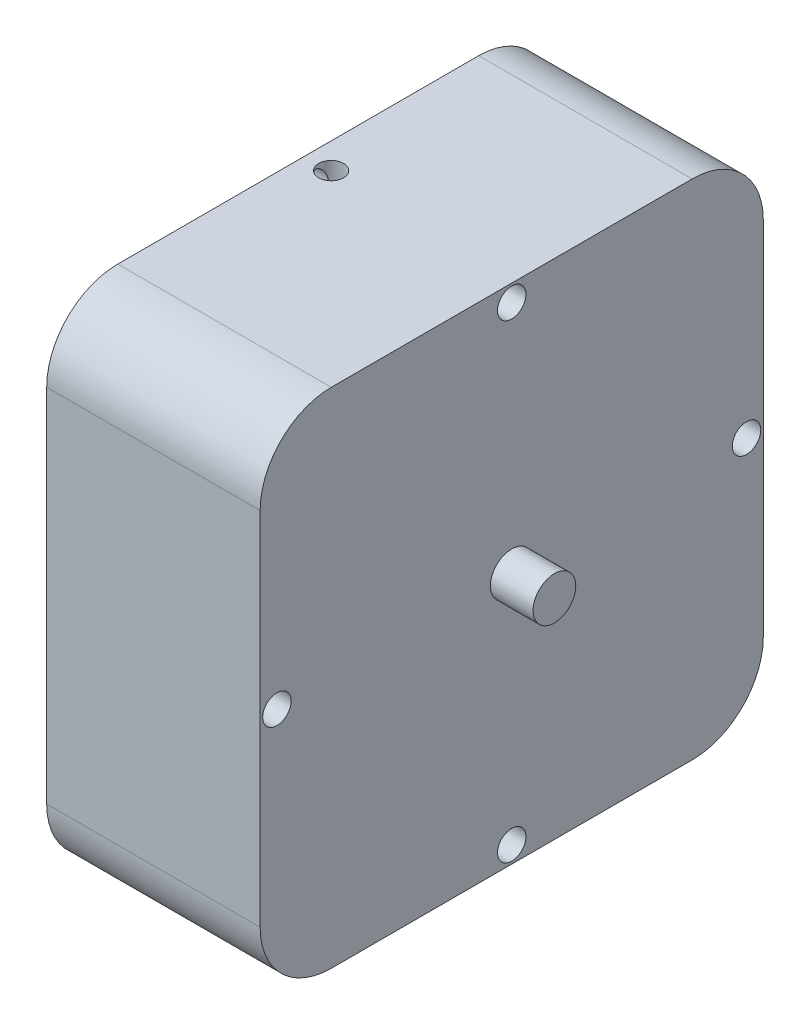
ISO-10303-21;
HEADER;
FILE_DESCRIPTION(('STEP AP214'),'2;1');
FILE_NAME('part.step','',(''),(''),'','','');
FILE_SCHEMA(('AUTOMOTIVE_DESIGN { 1 0 10303 214 1 1 1 1 }'));
ENDSEC;
DATA;
#1=APPLICATION_CONTEXT('core data for automotive mechanical design processes');
#2=APPLICATION_PROTOCOL_DEFINITION('international standard','automotive_design',2000,#1);
#3=PRODUCT_CONTEXT('',#1,'mechanical');
#4=PRODUCT('Part','Part','',(#3));
#5=PRODUCT_RELATED_PRODUCT_CATEGORY('part','',(#4));
#6=PRODUCT_DEFINITION_FORMATION('','',#4);
#7=PRODUCT_DEFINITION_CONTEXT('part definition',#1,'design');
#8=PRODUCT_DEFINITION('design','',#6,#7);
#9=PRODUCT_DEFINITION_SHAPE('','',#8);
#10=(LENGTH_UNIT() NAMED_UNIT(*) SI_UNIT(.MILLI.,.METRE.));
#11=(NAMED_UNIT(*) PLANE_ANGLE_UNIT() SI_UNIT($,.RADIAN.));
#12=(NAMED_UNIT(*) SI_UNIT($,.STERADIAN.) SOLID_ANGLE_UNIT());
#13=UNCERTAINTY_MEASURE_WITH_UNIT(LENGTH_MEASURE(1.E-05),#10,'distance_accuracy_value','');
#14=(GEOMETRIC_REPRESENTATION_CONTEXT(3) GLOBAL_UNCERTAINTY_ASSIGNED_CONTEXT((#13)) GLOBAL_UNIT_ASSIGNED_CONTEXT((#10,
#11,#12)) REPRESENTATION_CONTEXT('',''));
#15=CARTESIAN_POINT('',(0.,0.,0.));
#16=DIRECTION('',(0.,0.,1.));
#17=DIRECTION('',(1.,0.,0.));
#18=AXIS2_PLACEMENT_3D('',#15,#16,#17);
#19=CARTESIAN_POINT('',(30.,25.36,25.36));
#20=DIRECTION('',(1.,0.,0.));
#21=DIRECTION('',(0.,0.,-1.));
#22=AXIS2_PLACEMENT_3D('',#19,#20,#21);
#23=CYLINDRICAL_SURFACE('',#22,10.);
#24=DIRECTION('',(1.,0.,0.));
#25=VECTOR('',#24,1.);
#26=CARTESIAN_POINT('',(30.,35.36,25.36));
#27=LINE('',#26,#25);
#28=CARTESIAN_POINT('',(0.,35.36,25.36));
#29=VERTEX_POINT('',#28);
#30=CARTESIAN_POINT('',(30.,35.36,25.36));
#31=VERTEX_POINT('',#30);
#32=EDGE_CURVE('E161',#29,#31,#27,.T.);
#33=ORIENTED_EDGE('',*,*,#32,.F.);
#34=CARTESIAN_POINT('',(0.,25.36,25.36));
#35=DIRECTION('',(1.,0.,0.));
#36=DIRECTION('',(0.,0.,-1.));
#37=AXIS2_PLACEMENT_3D('',#34,#35,#36);
#38=CIRCLE('',#37,10.);
#39=CARTESIAN_POINT('',(0.,25.36,35.36));
#40=VERTEX_POINT('',#39);
#41=EDGE_CURVE('E46',#40,#29,#38,.F.);
#42=ORIENTED_EDGE('',*,*,#41,.F.);
#43=DIRECTION('',(1.,0.,0.));
#44=VECTOR('',#43,1.);
#45=CARTESIAN_POINT('',(30.,25.36,35.36));
#46=LINE('',#45,#44);
#47=CARTESIAN_POINT('',(30.,25.36,35.36));
#48=VERTEX_POINT('',#47);
#49=EDGE_CURVE('E164',#48,#40,#46,.F.);
#50=ORIENTED_EDGE('',*,*,#49,.F.);
#51=CARTESIAN_POINT('',(30.,25.36,25.36));
#52=DIRECTION('',(1.,0.,0.));
#53=DIRECTION('',(0.,0.,-1.));
#54=AXIS2_PLACEMENT_3D('',#51,#52,#53);
#55=CIRCLE('',#54,10.);
#56=EDGE_CURVE('E11',#31,#48,#55,.T.);
#57=ORIENTED_EDGE('',*,*,#56,.F.);
#58=EDGE_LOOP('',(#33,#42,#50,#57));
#59=FACE_BOUND('',#58,.T.);
#60=ADVANCED_FACE('F39',(#59),#23,.T.);
#61=CARTESIAN_POINT('',(30.,-25.36,25.36));
#62=DIRECTION('',(1.,0.,0.));
#63=DIRECTION('',(0.,0.,-1.));
#64=AXIS2_PLACEMENT_3D('',#61,#62,#63);
#65=CYLINDRICAL_SURFACE('',#64,10.);
#66=DIRECTION('',(1.,0.,0.));
#67=VECTOR('',#66,1.);
#68=CARTESIAN_POINT('',(30.,-25.36,35.36));
#69=LINE('',#68,#67);
#70=CARTESIAN_POINT('',(0.,-25.36,35.36));
#71=VERTEX_POINT('',#70);
#72=CARTESIAN_POINT('',(30.,-25.36,35.36));
#73=VERTEX_POINT('',#72);
#74=EDGE_CURVE('E150',#71,#73,#69,.T.);
#75=ORIENTED_EDGE('',*,*,#74,.F.);
#76=CARTESIAN_POINT('',(0.,-25.36,25.36));
#77=DIRECTION('',(1.,0.,0.));
#78=DIRECTION('',(0.,0.,-1.));
#79=AXIS2_PLACEMENT_3D('',#76,#77,#78);
#80=CIRCLE('',#79,10.);
#81=CARTESIAN_POINT('',(0.,-35.36,25.36));
#82=VERTEX_POINT('',#81);
#83=EDGE_CURVE('E156',#82,#71,#80,.F.);
#84=ORIENTED_EDGE('',*,*,#83,.F.);
#85=DIRECTION('',(1.,0.,0.));
#86=VECTOR('',#85,1.);
#87=CARTESIAN_POINT('',(30.,-35.36,25.36));
#88=LINE('',#87,#86);
#89=CARTESIAN_POINT('',(30.,-35.36,25.36));
#90=VERTEX_POINT('',#89);
#91=EDGE_CURVE('E153',#90,#82,#88,.F.);
#92=ORIENTED_EDGE('',*,*,#91,.F.);
#93=CARTESIAN_POINT('',(30.,-25.36,25.36));
#94=DIRECTION('',(1.,0.,0.));
#95=DIRECTION('',(0.,0.,-1.));
#96=AXIS2_PLACEMENT_3D('',#93,#94,#95);
#97=CIRCLE('',#96,10.);
#98=EDGE_CURVE('E159',#73,#90,#97,.T.);
#99=ORIENTED_EDGE('',*,*,#98,.F.);
#100=EDGE_LOOP('',(#75,#84,#92,#99));
#101=FACE_BOUND('',#100,.T.);
#102=ADVANCED_FACE('F189',(#101),#65,.T.);
#103=CARTESIAN_POINT('',(30.,-25.36,-25.36));
#104=DIRECTION('',(1.,0.,0.));
#105=DIRECTION('',(0.,0.,-1.));
#106=AXIS2_PLACEMENT_3D('',#103,#104,#105);
#107=CYLINDRICAL_SURFACE('',#106,10.);
#108=DIRECTION('',(1.,0.,0.));
#109=VECTOR('',#108,1.);
#110=CARTESIAN_POINT('',(30.,-35.36,-25.36));
#111=LINE('',#110,#109);
#112=CARTESIAN_POINT('',(0.,-35.36,-25.36));
#113=VERTEX_POINT('',#112);
#114=CARTESIAN_POINT('',(30.,-35.36,-25.36));
#115=VERTEX_POINT('',#114);
#116=EDGE_CURVE('E142',#113,#115,#111,.T.);
#117=ORIENTED_EDGE('',*,*,#116,.F.);
#118=CARTESIAN_POINT('',(0.,-25.36,-25.36));
#119=DIRECTION('',(1.,0.,0.));
#120=DIRECTION('',(0.,0.,-1.));
#121=AXIS2_PLACEMENT_3D('',#118,#119,#120);
#122=CIRCLE('',#121,10.);
#123=CARTESIAN_POINT('',(0.,-25.36,-35.36));
#124=VERTEX_POINT('',#123);
#125=EDGE_CURVE('E146',#124,#113,#122,.F.);
#126=ORIENTED_EDGE('',*,*,#125,.F.);
#127=DIRECTION('',(1.,0.,0.));
#128=VECTOR('',#127,1.);
#129=CARTESIAN_POINT('',(30.,-25.36,-35.36));
#130=LINE('',#129,#128);
#131=CARTESIAN_POINT('',(30.,-25.36,-35.36));
#132=VERTEX_POINT('',#131);
#133=EDGE_CURVE('E108',#132,#124,#130,.F.);
#134=ORIENTED_EDGE('',*,*,#133,.F.);
#135=CARTESIAN_POINT('',(30.,-25.36,-25.36));
#136=DIRECTION('',(1.,0.,0.));
#137=DIRECTION('',(0.,0.,-1.));
#138=AXIS2_PLACEMENT_3D('',#135,#136,#137);
#139=CIRCLE('',#138,10.);
#140=EDGE_CURVE('E148',#115,#132,#139,.T.);
#141=ORIENTED_EDGE('',*,*,#140,.F.);
#142=EDGE_LOOP('',(#117,#126,#134,#141));
#143=FACE_BOUND('',#142,.T.);
#144=ADVANCED_FACE('F196',(#143),#107,.T.);
#145=CARTESIAN_POINT('',(30.,25.36,-25.36));
#146=DIRECTION('',(1.,0.,0.));
#147=DIRECTION('',(0.,0.,-1.));
#148=AXIS2_PLACEMENT_3D('',#145,#146,#147);
#149=CYLINDRICAL_SURFACE('',#148,10.);
#150=DIRECTION('',(1.,0.,0.));
#151=VECTOR('',#150,1.);
#152=CARTESIAN_POINT('',(30.,25.36,-35.36));
#153=LINE('',#152,#151);
#154=CARTESIAN_POINT('',(0.,25.36,-35.36));
#155=VERTEX_POINT('',#154);
#156=CARTESIAN_POINT('',(30.,25.36,-35.36));
#157=VERTEX_POINT('',#156);
#158=EDGE_CURVE('E106',#155,#157,#153,.T.);
#159=ORIENTED_EDGE('',*,*,#158,.F.);
#160=CARTESIAN_POINT('',(0.,25.36,-25.36));
#161=DIRECTION('',(1.,0.,0.));
#162=DIRECTION('',(0.,0.,-1.));
#163=AXIS2_PLACEMENT_3D('',#160,#161,#162);
#164=CIRCLE('',#163,10.);
#165=CARTESIAN_POINT('',(0.,35.36,-25.36));
#166=VERTEX_POINT('',#165);
#167=EDGE_CURVE('E115',#166,#155,#164,.F.);
#168=ORIENTED_EDGE('',*,*,#167,.F.);
#169=DIRECTION('',(1.,0.,0.));
#170=VECTOR('',#169,1.);
#171=CARTESIAN_POINT('',(30.,35.36,-25.36));
#172=LINE('',#171,#170);
#173=CARTESIAN_POINT('',(30.,35.36,-25.36));
#174=VERTEX_POINT('',#173);
#175=EDGE_CURVE('E123',#174,#166,#172,.F.);
#176=ORIENTED_EDGE('',*,*,#175,.F.);
#177=CARTESIAN_POINT('',(30.,25.36,-25.36));
#178=DIRECTION('',(1.,0.,0.));
#179=DIRECTION('',(0.,0.,-1.));
#180=AXIS2_PLACEMENT_3D('',#177,#178,#179);
#181=CIRCLE('',#180,10.);
#182=EDGE_CURVE('E122',#157,#174,#181,.T.);
#183=ORIENTED_EDGE('',*,*,#182,.F.);
#184=EDGE_LOOP('',(#159,#168,#176,#183));
#185=FACE_BOUND('',#184,.T.);
#186=ADVANCED_FACE('F126',(#185),#149,.T.);
#187=CARTESIAN_POINT('',(30.,35.36,-35.36));
#188=DIRECTION('',(0.,0.,1.));
#189=DIRECTION('',(1.,0.,0.));
#190=AXIS2_PLACEMENT_3D('',#187,#188,#189);
#191=PLANE('',#190);
#192=DIRECTION('',(0.,1.,0.));
#193=VECTOR('',#192,1.);
#194=CARTESIAN_POINT('',(30.,35.36,-35.36));
#195=LINE('',#194,#193);
#196=EDGE_CURVE('E172',#132,#157,#195,.T.);
#197=ORIENTED_EDGE('',*,*,#196,.F.);
#198=ORIENTED_EDGE('',*,*,#133,.T.);
#199=DIRECTION('',(0.,1.,0.));
#200=VECTOR('',#199,1.);
#201=CARTESIAN_POINT('',(0.,35.36,-35.36));
#202=LINE('',#201,#200);
#203=EDGE_CURVE('E101',#124,#155,#202,.T.);
#204=ORIENTED_EDGE('',*,*,#203,.T.);
#205=ORIENTED_EDGE('',*,*,#158,.T.);
#206=EDGE_LOOP('',(#197,#198,#204,#205));
#207=FACE_BOUND('',#206,.T.);
#208=ADVANCED_FACE('F104',(#207),#191,.F.);
#209=CARTESIAN_POINT('',(30.,35.36,35.36));
#210=DIRECTION('',(0.,-1.,0.));
#211=DIRECTION('',(0.,0.,-1.));
#212=AXIS2_PLACEMENT_3D('',#209,#210,#211);
#213=PLANE('',#212);
#214=CARTESIAN_POINT('',(3.62,35.36,-0.999999999999997));
#215=DIRECTION('',(0.,1.,0.));
#216=DIRECTION('',(0.,0.,1.));
#217=AXIS2_PLACEMENT_3D('',#214,#215,#216);
#218=CIRCLE('',#217,1.75);
#219=CARTESIAN_POINT('',(3.62,35.36,0.750000000000003));
#220=VERTEX_POINT('',#219);
#221=EDGE_CURVE('E421',#220,#220,#218,.T.);
#222=ORIENTED_EDGE('',*,*,#221,.F.);
#223=EDGE_LOOP('',(#222));
#224=FACE_BOUND('',#223,.T.);
#225=DIRECTION('',(0.,0.,1.));
#226=VECTOR('',#225,1.);
#227=CARTESIAN_POINT('',(0.,35.36,35.36));
#228=LINE('',#227,#226);
#229=EDGE_CURVE('E111',#166,#29,#228,.T.);
#230=ORIENTED_EDGE('',*,*,#229,.T.);
#231=ORIENTED_EDGE('',*,*,#32,.T.);
#232=DIRECTION('',(0.,0.,1.));
#233=VECTOR('',#232,1.);
#234=CARTESIAN_POINT('',(30.,35.36,35.36));
#235=LINE('',#234,#233);
#236=EDGE_CURVE('E175',#174,#31,#235,.T.);
#237=ORIENTED_EDGE('',*,*,#236,.F.);
#238=ORIENTED_EDGE('',*,*,#175,.T.);
#239=EDGE_LOOP('',(#230,#231,#237,#238));
#240=FACE_BOUND('',#239,.T.);
#241=ADVANCED_FACE('F168',(#224,#240),#213,.F.);
#242=CARTESIAN_POINT('',(30.,35.36,35.36));
#243=DIRECTION('',(0.,0.,-1.));
#244=DIRECTION('',(0.,1.,0.));
#245=AXIS2_PLACEMENT_3D('',#242,#243,#244);
#246=PLANE('',#245);
#247=DIRECTION('',(0.,-1.,0.));
#248=VECTOR('',#247,1.);
#249=CARTESIAN_POINT('',(30.,35.36,35.36));
#250=LINE('',#249,#248);
#251=EDGE_CURVE('E130',#48,#73,#250,.T.);
#252=ORIENTED_EDGE('',*,*,#251,.F.);
#253=ORIENTED_EDGE('',*,*,#49,.T.);
#254=DIRECTION('',(0.,-1.,0.));
#255=VECTOR('',#254,1.);
#256=CARTESIAN_POINT('',(0.,35.36,35.36));
#257=LINE('',#256,#255);
#258=EDGE_CURVE('E165',#40,#71,#257,.T.);
#259=ORIENTED_EDGE('',*,*,#258,.T.);
#260=ORIENTED_EDGE('',*,*,#74,.T.);
#261=EDGE_LOOP('',(#252,#253,#259,#260));
#262=FACE_BOUND('',#261,.T.);
#263=ADVANCED_FACE('F191',(#262),#246,.F.);
#264=CARTESIAN_POINT('',(30.,-35.36,35.36));
#265=DIRECTION('',(0.,1.,0.));
#266=DIRECTION('',(0.,0.,1.));
#267=AXIS2_PLACEMENT_3D('',#264,#265,#266);
#268=PLANE('',#267);
#269=DIRECTION('',(0.,0.,-1.));
#270=VECTOR('',#269,1.);
#271=CARTESIAN_POINT('',(30.,-35.36,35.36));
#272=LINE('',#271,#270);
#273=EDGE_CURVE('E127',#90,#115,#272,.T.);
#274=ORIENTED_EDGE('',*,*,#273,.F.);
#275=ORIENTED_EDGE('',*,*,#91,.T.);
#276=DIRECTION('',(0.,0.,-1.));
#277=VECTOR('',#276,1.);
#278=CARTESIAN_POINT('',(0.,-35.36,35.36));
#279=LINE('',#278,#277);
#280=EDGE_CURVE('E170',#82,#113,#279,.T.);
#281=ORIENTED_EDGE('',*,*,#280,.T.);
#282=ORIENTED_EDGE('',*,*,#116,.T.);
#283=EDGE_LOOP('',(#274,#275,#281,#282));
#284=FACE_BOUND('',#283,.T.);
#285=ADVANCED_FACE('F192',(#284),#268,.F.);
#286=CARTESIAN_POINT('',(30.,0.,0.));
#287=DIRECTION('',(1.,0.,0.));
#288=DIRECTION('',(0.,0.,-1.));
#289=AXIS2_PLACEMENT_3D('',#286,#287,#288);
#290=PLANE('',#289);
#291=CARTESIAN_POINT('',(30.,33.,0.));
#292=DIRECTION('',(1.,0.,0.));
#293=DIRECTION('',(0.,0.,-1.));
#294=AXIS2_PLACEMENT_3D('',#291,#292,#293);
#295=CIRCLE('',#294,2.);
#296=CARTESIAN_POINT('',(30.,33.,-2.));
#297=VERTEX_POINT('',#296);
#298=EDGE_CURVE('E453',#297,#297,#295,.T.);
#299=ORIENTED_EDGE('',*,*,#298,.F.);
#300=EDGE_LOOP('',(#299));
#301=FACE_BOUND('',#300,.T.);
#302=CARTESIAN_POINT('',(30.,-1.15218884181823E-13,33.));
#303=DIRECTION('',(1.,0.,0.));
#304=DIRECTION('',(0.,0.,-1.));
#305=AXIS2_PLACEMENT_3D('',#302,#303,#304);
#306=CIRCLE('',#305,2.);
#307=CARTESIAN_POINT('',(30.,-1.15218884181823E-13,31.));
#308=VERTEX_POINT('',#307);
#309=EDGE_CURVE('E424',#308,#308,#306,.T.);
#310=ORIENTED_EDGE('',*,*,#309,.F.);
#311=EDGE_LOOP('',(#310));
#312=FACE_BOUND('',#311,.T.);
#313=CARTESIAN_POINT('',(30.,-33.,-2.30437768363647E-13));
#314=DIRECTION('',(1.,0.,0.));
#315=DIRECTION('',(0.,0.,-1.));
#316=AXIS2_PLACEMENT_3D('',#313,#314,#315);
#317=CIRCLE('',#316,2.);
#318=CARTESIAN_POINT('',(30.,-33.,-2.00000000000023));
#319=VERTEX_POINT('',#318);
#320=EDGE_CURVE('E430',#319,#319,#317,.T.);
#321=ORIENTED_EDGE('',*,*,#320,.F.);
#322=EDGE_LOOP('',(#321));
#323=FACE_BOUND('',#322,.T.);
#324=CARTESIAN_POINT('',(30.,3.4565665254547E-13,-33.));
#325=DIRECTION('',(1.,0.,0.));
#326=DIRECTION('',(0.,0.,-1.));
#327=AXIS2_PLACEMENT_3D('',#324,#325,#326);
#328=CIRCLE('',#327,2.);
#329=CARTESIAN_POINT('',(30.,3.4565665254547E-13,-35.));
#330=VERTEX_POINT('',#329);
#331=EDGE_CURVE('E450',#330,#330,#328,.T.);
#332=ORIENTED_EDGE('',*,*,#331,.F.);
#333=EDGE_LOOP('',(#332));
#334=FACE_BOUND('',#333,.T.);
#335=CARTESIAN_POINT('',(30.,0.,0.));
#336=DIRECTION('',(1.,0.,0.));
#337=DIRECTION('',(0.,0.,-1.));
#338=AXIS2_PLACEMENT_3D('',#335,#336,#337);
#339=CIRCLE('',#338,3.);
#340=CARTESIAN_POINT('',(30.,0.,-3.));
#341=VERTEX_POINT('',#340);
#342=EDGE_CURVE('E427',#341,#341,#339,.T.);
#343=ORIENTED_EDGE('',*,*,#342,.F.);
#344=EDGE_LOOP('',(#343));
#345=FACE_BOUND('',#344,.T.);
#346=ORIENTED_EDGE('',*,*,#236,.T.);
#347=ORIENTED_EDGE('',*,*,#56,.T.);
#348=ORIENTED_EDGE('',*,*,#251,.T.);
#349=ORIENTED_EDGE('',*,*,#98,.T.);
#350=ORIENTED_EDGE('',*,*,#273,.T.);
#351=ORIENTED_EDGE('',*,*,#140,.T.);
#352=ORIENTED_EDGE('',*,*,#196,.T.);
#353=ORIENTED_EDGE('',*,*,#182,.T.);
#354=EDGE_LOOP('',(#346,#347,#348,#349,#350,#351,#352,#353));
#355=FACE_BOUND('',#354,.T.);
#356=ADVANCED_FACE('F184',(#301,#312,#323,#334,#345,#355),#290,.T.);
#357=CARTESIAN_POINT('',(0.,0.,0.));
#358=DIRECTION('',(1.,0.,0.));
#359=DIRECTION('',(0.,0.,-1.));
#360=AXIS2_PLACEMENT_3D('',#357,#358,#359);
#361=PLANE('',#360);
#362=CARTESIAN_POINT('',(0.,33.,0.));
#363=DIRECTION('',(-1.,0.,0.));
#364=DIRECTION('',(0.,0.,1.));
#365=AXIS2_PLACEMENT_3D('',#362,#363,#364);
#366=CIRCLE('',#365,2.);
#367=CARTESIAN_POINT('',(0.,33.,2.));
#368=VERTEX_POINT('',#367);
#369=EDGE_CURVE('E465',#368,#368,#366,.T.);
#370=ORIENTED_EDGE('',*,*,#369,.F.);
#371=EDGE_LOOP('',(#370));
#372=FACE_BOUND('',#371,.T.);
#373=CARTESIAN_POINT('',(0.,-1.15218884181823E-13,33.));
#374=DIRECTION('',(-1.,0.,0.));
#375=DIRECTION('',(0.,0.,1.));
#376=AXIS2_PLACEMENT_3D('',#373,#374,#375);
#377=CIRCLE('',#376,2.);
#378=CARTESIAN_POINT('',(0.,-1.15218884181823E-13,35.));
#379=VERTEX_POINT('',#378);
#380=EDGE_CURVE('E462',#379,#379,#377,.T.);
#381=ORIENTED_EDGE('',*,*,#380,.F.);
#382=EDGE_LOOP('',(#381));
#383=FACE_BOUND('',#382,.T.);
#384=CARTESIAN_POINT('',(0.,-33.,-2.30437768363647E-13));
#385=DIRECTION('',(-1.,0.,0.));
#386=DIRECTION('',(0.,0.,1.));
#387=AXIS2_PLACEMENT_3D('',#384,#385,#386);
#388=CIRCLE('',#387,2.);
#389=CARTESIAN_POINT('',(0.,-33.,1.99999999999977));
#390=VERTEX_POINT('',#389);
#391=EDGE_CURVE('E459',#390,#390,#388,.T.);
#392=ORIENTED_EDGE('',*,*,#391,.F.);
#393=EDGE_LOOP('',(#392));
#394=FACE_BOUND('',#393,.T.);
#395=CARTESIAN_POINT('',(0.,3.4565665254547E-13,-33.));
#396=DIRECTION('',(-1.,0.,0.));
#397=DIRECTION('',(0.,0.,1.));
#398=AXIS2_PLACEMENT_3D('',#395,#396,#397);
#399=CIRCLE('',#398,2.);
#400=CARTESIAN_POINT('',(0.,3.4565665254547E-13,-31.));
#401=VERTEX_POINT('',#400);
#402=EDGE_CURVE('E456',#401,#401,#399,.T.);
#403=ORIENTED_EDGE('',*,*,#402,.F.);
#404=EDGE_LOOP('',(#403));
#405=FACE_BOUND('',#404,.T.);
#406=CARTESIAN_POINT('',(0.,0.,0.));
#407=DIRECTION('',(-1.,0.,0.));
#408=DIRECTION('',(0.,0.,1.));
#409=AXIS2_PLACEMENT_3D('',#406,#407,#408);
#410=CIRCLE('',#409,3.);
#411=CARTESIAN_POINT('',(0.,0.,3.));
#412=VERTEX_POINT('',#411);
#413=EDGE_CURVE('E179',#412,#412,#410,.T.);
#414=ORIENTED_EDGE('',*,*,#413,.F.);
#415=EDGE_LOOP('',(#414));
#416=FACE_BOUND('',#415,.T.);
#417=ORIENTED_EDGE('',*,*,#258,.F.);
#418=ORIENTED_EDGE('',*,*,#41,.T.);
#419=ORIENTED_EDGE('',*,*,#229,.F.);
#420=ORIENTED_EDGE('',*,*,#167,.T.);
#421=ORIENTED_EDGE('',*,*,#203,.F.);
#422=ORIENTED_EDGE('',*,*,#125,.T.);
#423=ORIENTED_EDGE('',*,*,#280,.F.);
#424=ORIENTED_EDGE('',*,*,#83,.T.);
#425=EDGE_LOOP('',(#417,#418,#419,#420,#421,#422,#423,#424));
#426=FACE_BOUND('',#425,.T.);
#427=ADVANCED_FACE('F117',(#372,#383,#394,#405,#416,#426),#361,.F.);
#428=CARTESIAN_POINT('',(6.,0.,0.));
#429=DIRECTION('',(-1.,0.,0.));
#430=DIRECTION('',(0.,0.,1.));
#431=AXIS2_PLACEMENT_3D('',#428,#429,#430);
#432=CYLINDRICAL_SURFACE('',#431,3.);
#433=CARTESIAN_POINT('',(6.,0.,0.));
#434=DIRECTION('',(-1.,0.,0.));
#435=DIRECTION('',(0.,0.,1.));
#436=AXIS2_PLACEMENT_3D('',#433,#434,#435);
#437=CIRCLE('',#436,3.);
#438=CARTESIAN_POINT('',(6.,0.,3.));
#439=VERTEX_POINT('',#438);
#440=EDGE_CURVE('E112',#439,#439,#437,.T.);
#441=ORIENTED_EDGE('',*,*,#440,.F.);
#442=EDGE_LOOP('',(#441));
#443=FACE_BOUND('',#442,.T.);
#444=ORIENTED_EDGE('',*,*,#413,.T.);
#445=EDGE_LOOP('',(#444));
#446=FACE_BOUND('',#445,.T.);
#447=ADVANCED_FACE('F247',(#443,#446),#432,.F.);
#448=CARTESIAN_POINT('',(6.,0.,0.));
#449=DIRECTION('',(-1.,0.,0.));
#450=DIRECTION('',(0.,0.,1.));
#451=AXIS2_PLACEMENT_3D('',#448,#449,#450);
#452=PLANE('',#451);
#453=ORIENTED_EDGE('',*,*,#440,.T.);
#454=EDGE_LOOP('',(#453));
#455=FACE_BOUND('',#454,.T.);
#456=ADVANCED_FACE('F255',(#455),#452,.T.);
#457=CARTESIAN_POINT('',(36.,0.,0.));
#458=DIRECTION('',(-1.,0.,0.));
#459=DIRECTION('',(0.,0.,1.));
#460=AXIS2_PLACEMENT_3D('',#457,#458,#459);
#461=CYLINDRICAL_SURFACE('',#460,3.);
#462=CARTESIAN_POINT('',(36.,0.,0.));
#463=DIRECTION('',(1.,0.,0.));
#464=DIRECTION('',(0.,0.,-1.));
#465=AXIS2_PLACEMENT_3D('',#462,#463,#464);
#466=CIRCLE('',#465,3.);
#467=CARTESIAN_POINT('',(36.,0.,-3.));
#468=VERTEX_POINT('',#467);
#469=EDGE_CURVE('E433',#468,#468,#466,.T.);
#470=ORIENTED_EDGE('',*,*,#469,.F.);
#471=EDGE_LOOP('',(#470));
#472=FACE_BOUND('',#471,.T.);
#473=ORIENTED_EDGE('',*,*,#342,.T.);
#474=EDGE_LOOP('',(#473));
#475=FACE_BOUND('',#474,.T.);
#476=ADVANCED_FACE('F263',(#472,#475),#461,.T.);
#477=CARTESIAN_POINT('',(36.,0.,0.));
#478=DIRECTION('',(1.,0.,0.));
#479=DIRECTION('',(0.,0.,-1.));
#480=AXIS2_PLACEMENT_3D('',#477,#478,#479);
#481=PLANE('',#480);
#482=ORIENTED_EDGE('',*,*,#469,.T.);
#483=EDGE_LOOP('',(#482));
#484=FACE_BOUND('',#483,.T.);
#485=ADVANCED_FACE('F272',(#484),#481,.T.);
#486=CARTESIAN_POINT('',(3.62,29.36,-0.999999999999997));
#487=DIRECTION('',(0.,1.,0.));
#488=DIRECTION('',(0.,0.,1.));
#489=AXIS2_PLACEMENT_3D('',#486,#487,#488);
#490=CYLINDRICAL_SURFACE('',#489,1.75);
#491=CARTESIAN_POINT('',(3.62,31.1459503782261,0.750000000000003));
#492=CARTESIAN_POINT('',(3.71567122252247,31.1459427294288,0.749995265416012));
#493=CARTESIAN_POINT('',(3.81149400773041,31.1426978377551,0.742108324100708));
#494=CARTESIAN_POINT('',(4.00034547105171,31.1305235333333,0.710861383675902));
#495=CARTESIAN_POINT('',(4.09336625940954,31.1215794018247,0.687461314282283));
#496=CARTESIAN_POINT('',(4.27362618915483,31.1002626292303,0.626130117337538));
#497=CARTESIAN_POINT('',(4.36088703990053,31.0879038947062,0.588257696224092));
#498=CARTESIAN_POINT('',(4.5280861394462,31.062684888981,0.498955845977584));
#499=CARTESIAN_POINT('',(4.60802355312473,31.0498245608188,0.447524873294089));
#500=CARTESIAN_POINT('',(4.76222214672776,31.0263785463246,0.329536723755242));
#501=CARTESIAN_POINT('',(4.83606380249904,31.015921852872,0.262401207933747));
#502=CARTESIAN_POINT('',(4.97154318498522,31.0020288298845,0.116126572924532));
#503=CARTESIAN_POINT('',(5.03319183999441,30.9985861878414,0.0369983159497344));
#504=CARTESIAN_POINT('',(5.13772296277647,31.0023531839096,-0.123937878524319));
#505=CARTESIAN_POINT('',(5.18169794349257,31.0087486535844,-0.205049078879844));
#506=CARTESIAN_POINT('',(5.25585616515758,31.033049426059,-0.371698384663576));
#507=CARTESIAN_POINT('',(5.28605634298406,31.0509405287607,-0.457230908906798));
#508=CARTESIAN_POINT('',(5.3290974288848,31.0957678645343,-0.616221403771476));
#509=CARTESIAN_POINT('',(5.34380450543892,31.1210425848853,-0.689655051472533));
#510=CARTESIAN_POINT('',(5.36364647601878,31.1805673899279,-0.834126829606587));
#511=CARTESIAN_POINT('',(5.36877950880369,31.2148192183374,-0.905164491613138));
#512=CARTESIAN_POINT('',(5.37083595501693,31.2916388504754,-1.04295380442132));
#513=CARTESIAN_POINT('',(5.36773264797927,31.3342333045966,-1.10969078399903));
#514=CARTESIAN_POINT('',(5.35503086533868,31.4266412193249,-1.23723617581522));
#515=CARTESIAN_POINT('',(5.34543070493518,31.4764565498564,-1.29804304554332));
#516=CARTESIAN_POINT('',(5.3196181145612,31.5911399683755,-1.42246774385959));
#517=CARTESIAN_POINT('',(5.30257148796752,31.6571336192018,-1.48487099566295));
#518=CARTESIAN_POINT('',(5.26509700600305,31.7964004914709,-1.59985128036666));
#519=CARTESIAN_POINT('',(5.24466441643199,31.869683847094,-1.65241433255971));
#520=CARTESIAN_POINT('',(5.19885341467715,32.0390255230096,-1.75740667097811));
#521=CARTESIAN_POINT('',(5.17335689119302,32.1365912436556,-1.80737306749631));
#522=CARTESIAN_POINT('',(5.12697816397803,32.3394987027212,-1.89096415359891));
#523=CARTESIAN_POINT('',(5.10609139385922,32.4448326067437,-1.92460505507327));
#524=CARTESIAN_POINT('',(5.07655358587552,32.6443353095237,-1.97035106133726));
#525=CARTESIAN_POINT('',(5.06650913788667,32.7377089804961,-1.98498344011316));
#526=CARTESIAN_POINT('',(5.05557745678009,32.9260667446993,-2.00086067101757));
#527=CARTESIAN_POINT('',(5.05467978686739,33.0210488785796,-2.00212078144195));
#528=CARTESIAN_POINT('',(5.06223071452228,33.2097593812072,-1.99121460892724));
#529=CARTESIAN_POINT('',(5.07067271271328,33.3034885879329,-1.97905780634633));
#530=CARTESIAN_POINT('',(5.09501405674426,33.4874112124937,-1.94197235852654));
#531=CARTESIAN_POINT('',(5.11092219252373,33.577600326567,-1.91702865597273));
#532=CARTESIAN_POINT('',(5.14814415163874,33.7573671520735,-1.85363256217801));
#533=CARTESIAN_POINT('',(5.169696332938,33.8466684585573,-1.8145443584692));
#534=CARTESIAN_POINT('',(5.21402296233502,34.0185152509202,-1.72397083188408));
#535=CARTESIAN_POINT('',(5.23679884698031,34.1010524960847,-1.67247067968607));
#536=CARTESIAN_POINT('',(5.28373131109178,34.272197316788,-1.5474646020449));
#537=CARTESIAN_POINT('',(5.30741756531207,34.3592895040399,-1.47167644822011));
#538=CARTESIAN_POINT('',(5.34532662682449,34.5199888050048,-1.30496843209341));
#539=CARTESIAN_POINT('',(5.35957134210494,34.5936268475918,-1.21408421617766));
#540=CARTESIAN_POINT('',(5.37060713372992,34.7044097318806,-1.04958579646888));
#541=CARTESIAN_POINT('',(5.37138758302347,34.7458432615005,-0.979120259981417));
#542=CARTESIAN_POINT('',(5.36362260058927,34.8196018839067,-0.834054015865772));
#543=CARTESIAN_POINT('',(5.35508597159807,34.8519355379411,-0.759457274542143));
#544=CARTESIAN_POINT('',(5.32734064645385,34.9069434547639,-0.608325172992275));
#545=CARTESIAN_POINT('',(5.3080896078941,34.9295787583757,-0.531783278349545));
#546=CARTESIAN_POINT('',(5.25845461555157,34.9651044534432,-0.38005150955174));
#547=CARTESIAN_POINT('',(5.22806913068696,34.9779935039584,-0.304861822829271));
#548=CARTESIAN_POINT('',(5.15877075266645,34.9945515445471,-0.163008830426277));
#549=CARTESIAN_POINT('',(5.12046270658593,34.9987170787215,-0.0961040963974897));
#550=CARTESIAN_POINT('',(5.03532876790393,35.0007711538258,0.0321206459063562));
#551=CARTESIAN_POINT('',(4.98850079505845,34.9986581598405,0.0934392847688713));
#552=CARTESIAN_POINT('',(4.88304277969146,34.989500199168,0.214161696716572));
#553=CARTESIAN_POINT('',(4.82374433289727,34.9820469956121,0.272948056048399));
#554=CARTESIAN_POINT('',(4.69766348584438,34.9640806746487,0.38132743470973));
#555=CARTESIAN_POINT('',(4.630875518504,34.953565271663,0.430913541690555));
#556=CARTESIAN_POINT('',(4.48079407577643,34.9301414156812,0.526618994220675));
#557=CARTESIAN_POINT('',(4.39651515908927,34.9171078840982,0.571170979222041));
#558=CARTESIAN_POINT('',(4.22158013218236,34.8931734036443,0.646103234795436));
#559=CARTESIAN_POINT('',(4.13092385761316,34.8822725097605,0.676483139987908));
#560=CARTESIAN_POINT('',(3.94233035403775,34.864962919212,0.722883938960019));
#561=CARTESIAN_POINT('',(3.84425159282752,34.8587142775012,0.738398085731686));
#562=CARTESIAN_POINT('',(3.64671591457171,34.8530167261339,0.75259250713544));
#563=CARTESIAN_POINT('',(3.54725976958409,34.8535641498586,0.751281859081254));
#564=CARTESIAN_POINT('',(3.35713517035316,34.8610159191363,0.732597395302313));
#565=CARTESIAN_POINT('',(3.26633541239328,34.8674770416605,0.716343201346525));
#566=CARTESIAN_POINT('',(3.08876148908296,34.88461644548,0.669944812498242));
#567=CARTESIAN_POINT('',(3.00198930878903,34.8952967821294,0.639793846717581));
#568=CARTESIAN_POINT('',(2.83160811325039,34.9188833454459,0.56520872423792));
#569=CARTESIAN_POINT('',(2.74820360268754,34.9318523479236,0.520328337342571));
#570=CARTESIAN_POINT('',(2.5895391628862,34.9566296419125,0.417599064170763));
#571=CARTESIAN_POINT('',(2.51428354072777,34.9684373193081,0.359743368952742));
#572=CARTESIAN_POINT('',(2.37047373048775,34.9879630265588,0.229243023769687));
#573=CARTESIAN_POINT('',(2.30239736370497,34.9954640387904,0.156033400957956));
#574=CARTESIAN_POINT('',(2.17960926038812,35.0015366875162,-0.00116156188895486));
#575=CARTESIAN_POINT('',(2.12487824509126,35.0001212850458,-0.0851310871762782));
#576=CARTESIAN_POINT('',(2.0363430005831,34.9858144538437,-0.250160924060528));
#577=CARTESIAN_POINT('',(2.00084704041221,34.9742742719866,-0.330427431113353));
#578=CARTESIAN_POINT('',(1.94277091156709,34.9400132729764,-0.493194477087015));
#579=CARTESIAN_POINT('',(1.92018123343804,34.9173007107478,-0.575693324136494));
#580=CARTESIAN_POINT('',(1.88952021408492,34.8638778189367,-0.729218097392116));
#581=CARTESIAN_POINT('',(1.88002175078171,34.8344694524343,-0.800423311400333));
#582=CARTESIAN_POINT('',(1.86965947047752,34.7673218524145,-0.939432831272657));
#583=CARTESIAN_POINT('',(1.8687978629394,34.7295804896905,-1.00723626248593));
#584=CARTESIAN_POINT('',(1.8743435677982,34.6445626587608,-1.14105928337489));
#585=CARTESIAN_POINT('',(1.88111982940598,34.5969011733489,-1.20681625877556));
#586=CARTESIAN_POINT('',(1.90053295507546,34.4944923821898,-1.33154657827843));
#587=CARTESIAN_POINT('',(1.91317182247187,34.439742658906,-1.3905175949193));
#588=CARTESIAN_POINT('',(1.94508137119412,34.3130106920299,-1.5116512796904));
#589=CARTESIAN_POINT('',(1.96515963062117,34.2397385022444,-1.57225076744762));
#590=CARTESIAN_POINT('',(2.0074189348576,34.085717344047,-1.68232373650952));
#591=CARTESIAN_POINT('',(2.02960347855687,34.0049559401708,-1.73177822770789));
#592=CARTESIAN_POINT('',(2.07689047851786,33.8204581535663,-1.82746238817236));
#593=CARTESIAN_POINT('',(2.10171856084011,33.7153123045901,-1.87118349689686));
#594=CARTESIAN_POINT('',(2.13311225237053,33.5522956213551,-1.92307713168238));
#595=CARTESIAN_POINT('',(2.14260062637388,33.4970865274922,-1.93809186491455));
#596=CARTESIAN_POINT('',(2.15896692588751,33.3852270718849,-1.96338512726579));
#597=CARTESIAN_POINT('',(2.16584663118157,33.3285777210246,-1.9736668865204));
#598=CARTESIAN_POINT('',(2.17611319885921,33.21795075775,-1.98882222608332));
#599=CARTESIAN_POINT('',(2.17969451987402,33.164032613203,-1.99399839962203));
#600=CARTESIAN_POINT('',(2.18382274356103,33.0558365102858,-1.99995422511256));
#601=CARTESIAN_POINT('',(2.18436980662196,33.0015585710858,-2.00073410944917));
#602=CARTESIAN_POINT('',(2.18238499978836,32.8931902820271,-1.99788092536753));
#603=CARTESIAN_POINT('',(2.17985399678483,32.8390998836522,-1.99424909944145));
#604=CARTESIAN_POINT('',(2.17191376580032,32.7315928374258,-1.98264607944293));
#605=CARTESIAN_POINT('',(2.16650331985623,32.6781764844811,-1.97467304907022));
#606=CARTESIAN_POINT('',(2.14833653297268,32.534057403269,-1.94718121063804));
#607=CARTESIAN_POINT('',(2.1330987346199,32.4444349878647,-1.92348255774055));
#608=CARTESIAN_POINT('',(2.09797234622715,32.2701384565334,-1.86435041392926));
#609=CARTESIAN_POINT('',(2.0780794299348,32.1854690357481,-1.82890599421128));
#610=CARTESIAN_POINT('',(2.03347682223897,32.009018595504,-1.74045478811288));
#611=CARTESIAN_POINT('',(2.0085044608426,31.9182510874437,-1.68555047432218));
#612=CARTESIAN_POINT('',(1.96126885217447,31.7460676686474,-1.56169345510934));
#613=CARTESIAN_POINT('',(1.93900441098861,31.6646476375304,-1.49274697696052));
#614=CARTESIAN_POINT('',(1.90475992438657,31.5245650957929,-1.35325798434364));
#615=CARTESIAN_POINT('',(1.89172860970239,31.4643259992933,-1.2845667546741));
#616=CARTESIAN_POINT('',(1.8739795406005,31.3533841391295,-1.13886702148481));
#617=CARTESIAN_POINT('',(1.86925511844665,31.3026737562344,-1.06186524138433));
#618=CARTESIAN_POINT('',(1.87094329059726,31.2119718175573,-0.900863717565469));
#619=CARTESIAN_POINT('',(1.8774571034442,31.1720814636053,-0.816806928141033));
#620=CARTESIAN_POINT('',(1.90403820387063,31.1049283542514,-0.645842771745452));
#621=CARTESIAN_POINT('',(1.92409232375992,31.077653374021,-0.558938252187169));
#622=CARTESIAN_POINT('',(1.97454222195533,31.0387787308234,-0.399215365816202));
#623=CARTESIAN_POINT('',(2.00300586372467,31.0254743535177,-0.326189247120555));
#624=CARTESIAN_POINT('',(2.06999149491843,31.0071716108308,-0.183812675985318));
#625=CARTESIAN_POINT('',(2.10851506709389,31.0021745533708,-0.114462804005022));
#626=CARTESIAN_POINT('',(2.19437610511551,30.9989891334782,0.0179837288101562));
#627=CARTESIAN_POINT('',(2.24165201052682,31.0007548151517,0.0811196163634015));
#628=CARTESIAN_POINT('',(2.3440539318405,31.0091547341307,0.200266598097837));
#629=CARTESIAN_POINT('',(2.39918218758629,31.0157903628142,0.25627565072477));
#630=CARTESIAN_POINT('',(2.52402386219868,31.0330908103406,0.367190668876703));
#631=CARTESIAN_POINT('',(2.5947018316837,31.044176123562,0.420945037537566));
#632=CARTESIAN_POINT('',(2.7433071391085,31.0673834602197,0.517154713470396));
#633=CARTESIAN_POINT('',(2.82124319845054,31.0795067294278,0.559596184353645));
#634=CARTESIAN_POINT('',(2.99212246518411,31.1034977678335,0.636466603305827));
#635=CARTESIAN_POINT('',(3.08576177309708,31.1151768575068,0.669418859341939));
#636=CARTESIAN_POINT('',(3.27757821486644,31.1335222899686,0.719012557392705));
#637=CARTESIAN_POINT('',(3.37574164113756,31.1402028380666,0.735700262700551));
#638=CARTESIAN_POINT('',(3.49874448400581,31.1443229309616,0.745963876071217));
#639=CARTESIAN_POINT('',(3.5229642203964,31.1449310853784,0.747476120194057));
#640=CARTESIAN_POINT('',(3.57145271698864,31.1457457837971,0.749494793594604));
#641=CARTESIAN_POINT('',(3.59572147822117,31.1459523192642,0.750001201497147));
#642=CARTESIAN_POINT('',(3.62,31.1459503782261,0.750000000000003));
#643=B_SPLINE_CURVE_WITH_KNOTS('',3,(#491,#492,#493,#494,#495,#496,#497,#498,#499,#500,#501,
#502,#503,#504,#505,#506,#507,#508,#509,#510,#511,#512,#513,#514,#515,#516,#517,#518,#519,#520,
#521,#522,#523,#524,#525,#526,#527,#528,#529,#530,#531,#532,#533,#534,#535,#536,#537,#538,#539,
#540,#541,#542,#543,#544,#545,#546,#547,#548,#549,#550,#551,#552,#553,#554,#555,#556,#557,#558,
#559,#560,#561,#562,#563,#564,#565,#566,#567,#568,#569,#570,#571,#572,#573,#574,#575,#576,#577,
#578,#579,#580,#581,#582,#583,#584,#585,#586,#587,#588,#589,#590,#591,#592,#593,#594,#595,#596,
#597,#598,#599,#600,#601,#602,#603,#604,#605,#606,#607,#608,#609,#610,#611,#612,#613,#614,#615,
#616,#617,#618,#619,#620,#621,#622,#623,#624,#625,#626,#627,#628,#629,#630,#631,#632,#633,#634,
#635,#636,#637,#638,#639,#640,#641,#642),.UNSPECIFIED.,.T.,.F.,(4,2,2,2,2,2,2,2,2,2,2,2,2,2,2,2,
2,2,2,2,2,2,2,2,2,2,2,2,2,2,2,2,2,2,2,2,2,2,2,2,2,2,2,2,2,2,2,2,2,2,2,2,2,2,2,2,2,2,2,2,2,2,2,2,
2,2,2,2,2,2,2,2,2,2,2,4),(0.,0.286913379813301,0.574570757148571,0.86107344369281,
1.14760876074762,1.44708754585595,1.74629668668,2.02204220676225,2.2974477625017,
2.53342747298273,2.76945305429146,3.00624528881881,3.24309895318356,3.51934659515813,
3.79598379256185,4.13215153586272,4.46798476412016,4.75184094551487,5.03537320071971,
5.31870524091394,5.60237169001738,5.90080980888468,6.19960627339991,6.55134166641105,
6.90225801434223,7.14649953114407,7.39051048918332,7.63549267533625,7.88050856128944,
8.11115033654892,8.34184850156751,8.59237231345362,8.84308359378633,9.13045785999068,
9.41783953476745,9.71470157188584,10.011403452725,10.2875411558437,10.5638135432778,
10.8493766674807,11.1350899963003,11.4341615336003,11.7327984364033,11.9967686109567,
12.2605440384517,12.4923694430626,12.7242541512631,12.9678386798124,13.2115065060031,
13.5019844737113,13.7929537100666,14.1406517777942,14.3144240248909,14.488077500334,
14.6506771965291,14.8132682977368,14.9758136182088,15.1384277477319,15.4190825473205,
15.6999992177567,16.0256344521485,16.351125590422,16.6269153091787,16.9024835571529,
17.180546719292,17.4583398590466,17.6956647477665,17.9330269978546,18.1687791343885,
18.4045986532047,18.6719899449166,18.9397067878899,19.238120070198,19.5356820393937,
19.6084906074211,19.6813007226968),.UNSPECIFIED.);
#644=CARTESIAN_POINT('',(3.62,31.1459503782261,0.750000000000003));
#645=VERTEX_POINT('',#644);
#646=EDGE_CURVE('E133',#645,#645,#643,.T.);
#647=ORIENTED_EDGE('',*,*,#646,.T.);
#648=EDGE_LOOP('',(#647));
#649=FACE_BOUND('',#648,.T.);
#650=CARTESIAN_POINT('',(3.62,29.36,-0.999999999999997));
#651=DIRECTION('',(0.,1.,0.));
#652=DIRECTION('',(0.,0.,1.));
#653=AXIS2_PLACEMENT_3D('',#650,#651,#652);
#654=CIRCLE('',#653,1.75);
#655=CARTESIAN_POINT('',(3.62,29.36,0.750000000000003));
#656=VERTEX_POINT('',#655);
#657=EDGE_CURVE('E423',#656,#656,#654,.T.);
#658=ORIENTED_EDGE('',*,*,#657,.F.);
#659=EDGE_LOOP('',(#658));
#660=FACE_BOUND('',#659,.T.);
#661=ORIENTED_EDGE('',*,*,#221,.T.);
#662=EDGE_LOOP('',(#661));
#663=FACE_BOUND('',#662,.T.);
#664=ADVANCED_FACE('F279',(#649,#660,#663),#490,.F.);
#665=CARTESIAN_POINT('',(3.62,29.36,-0.999999999999997));
#666=DIRECTION('',(0.,1.,0.));
#667=DIRECTION('',(0.,0.,1.));
#668=AXIS2_PLACEMENT_3D('',#665,#666,#667);
#669=PLANE('',#668);
#670=ORIENTED_EDGE('',*,*,#657,.T.);
#671=EDGE_LOOP('',(#670));
#672=FACE_BOUND('',#671,.T.);
#673=ADVANCED_FACE('F288',(#672),#669,.T.);
#674=CARTESIAN_POINT('',(36.,33.,0.));
#675=DIRECTION('',(-1.,0.,0.));
#676=DIRECTION('',(0.,0.,1.));
#677=AXIS2_PLACEMENT_3D('',#674,#675,#676);
#678=CYLINDRICAL_SURFACE('',#677,2.);
#679=ORIENTED_EDGE('',*,*,#298,.T.);
#680=EDGE_LOOP('',(#679));
#681=FACE_BOUND('',#680,.T.);
#682=ORIENTED_EDGE('',*,*,#369,.T.);
#683=EDGE_LOOP('',(#682));
#684=FACE_BOUND('',#683,.T.);
#685=ORIENTED_EDGE('',*,*,#646,.F.);
#686=EDGE_LOOP('',(#685));
#687=FACE_BOUND('',#686,.T.);
#688=ADVANCED_FACE('F295',(#681,#684,#687),#678,.F.);
#689=CARTESIAN_POINT('',(36.,3.4565665254547E-13,-33.));
#690=DIRECTION('',(-1.,0.,0.));
#691=DIRECTION('',(0.,0.,1.));
#692=AXIS2_PLACEMENT_3D('',#689,#690,#691);
#693=CYLINDRICAL_SURFACE('',#692,2.);
#694=ORIENTED_EDGE('',*,*,#331,.T.);
#695=EDGE_LOOP('',(#694));
#696=FACE_BOUND('',#695,.T.);
#697=ORIENTED_EDGE('',*,*,#402,.T.);
#698=EDGE_LOOP('',(#697));
#699=FACE_BOUND('',#698,.T.);
#700=ADVANCED_FACE('F302',(#696,#699),#693,.F.);
#701=CARTESIAN_POINT('',(36.,-33.,-2.30437768363647E-13));
#702=DIRECTION('',(-1.,0.,0.));
#703=DIRECTION('',(0.,0.,1.));
#704=AXIS2_PLACEMENT_3D('',#701,#702,#703);
#705=CYLINDRICAL_SURFACE('',#704,2.);
#706=ORIENTED_EDGE('',*,*,#320,.T.);
#707=EDGE_LOOP('',(#706));
#708=FACE_BOUND('',#707,.T.);
#709=ORIENTED_EDGE('',*,*,#391,.T.);
#710=EDGE_LOOP('',(#709));
#711=FACE_BOUND('',#710,.T.);
#712=ADVANCED_FACE('F309',(#708,#711),#705,.F.);
#713=CARTESIAN_POINT('',(36.,-1.15218884181823E-13,33.));
#714=DIRECTION('',(-1.,0.,0.));
#715=DIRECTION('',(0.,0.,1.));
#716=AXIS2_PLACEMENT_3D('',#713,#714,#715);
#717=CYLINDRICAL_SURFACE('',#716,2.);
#718=ORIENTED_EDGE('',*,*,#309,.T.);
#719=EDGE_LOOP('',(#718));
#720=FACE_BOUND('',#719,.T.);
#721=ORIENTED_EDGE('',*,*,#380,.T.);
#722=EDGE_LOOP('',(#721));
#723=FACE_BOUND('',#722,.T.);
#724=ADVANCED_FACE('F317',(#720,#723),#717,.F.);
#725=CLOSED_SHELL('',(#60,#102,#144,#186,#208,#241,#263,#285,#356,#427,#447,#456,#476,#485,#664,
#673,#688,#700,#712,#724));
#726=MANIFOLD_SOLID_BREP('B2',#725);
#727=ADVANCED_BREP_SHAPE_REPRESENTATION('',(#18,#726),#14);
#728=SHAPE_DEFINITION_REPRESENTATION(#9,#727);
ENDSEC;
END-ISO-10303-21;
